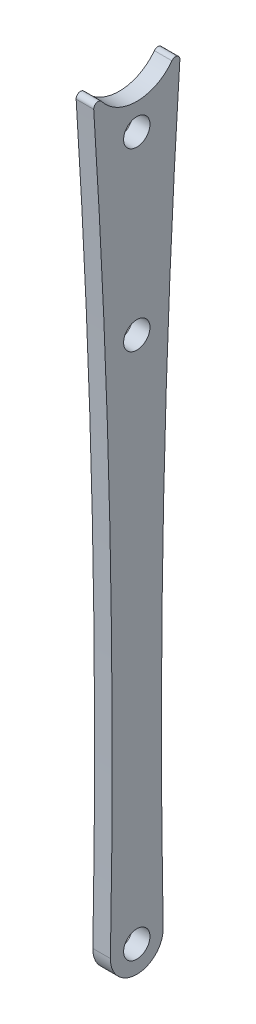
ISO-10303-21;
HEADER;
FILE_DESCRIPTION(('STEP AP214'),'2;1');
FILE_NAME('part.step','',(''),(''),'','','');
FILE_SCHEMA(('AUTOMOTIVE_DESIGN { 1 0 10303 214 1 1 1 1 }'));
ENDSEC;
DATA;
#1=APPLICATION_CONTEXT('core data for automotive mechanical design processes');
#2=APPLICATION_PROTOCOL_DEFINITION('international standard','automotive_design',2000,#1);
#3=PRODUCT_CONTEXT('',#1,'mechanical');
#4=PRODUCT('Part','Part','',(#3));
#5=PRODUCT_RELATED_PRODUCT_CATEGORY('part','',(#4));
#6=PRODUCT_DEFINITION_FORMATION('','',#4);
#7=PRODUCT_DEFINITION_CONTEXT('part definition',#1,'design');
#8=PRODUCT_DEFINITION('design','',#6,#7);
#9=PRODUCT_DEFINITION_SHAPE('','',#8);
#10=(LENGTH_UNIT() NAMED_UNIT(*) SI_UNIT(.MILLI.,.METRE.));
#11=(NAMED_UNIT(*) PLANE_ANGLE_UNIT() SI_UNIT($,.RADIAN.));
#12=(NAMED_UNIT(*) SI_UNIT($,.STERADIAN.) SOLID_ANGLE_UNIT());
#13=UNCERTAINTY_MEASURE_WITH_UNIT(LENGTH_MEASURE(1.E-05),#10,'distance_accuracy_value','');
#14=(GEOMETRIC_REPRESENTATION_CONTEXT(3) GLOBAL_UNCERTAINTY_ASSIGNED_CONTEXT((#13)) GLOBAL_UNIT_ASSIGNED_CONTEXT((#10,
#11,#12)) REPRESENTATION_CONTEXT('',''));
#15=CARTESIAN_POINT('',(0.,0.,0.));
#16=DIRECTION('',(0.,0.,1.));
#17=DIRECTION('',(1.,0.,0.));
#18=AXIS2_PLACEMENT_3D('',#15,#16,#17);
#19=CARTESIAN_POINT('',(2.,52.3191384121453,-503.600903748008));
#20=DIRECTION('',(-1.,0.,0.));
#21=DIRECTION('',(0.,0.,1.));
#22=AXIS2_PLACEMENT_3D('',#19,#20,#21);
#23=PLANE('',#22);
#24=CARTESIAN_POINT('',(2.,19.9382768242907,-1002.80180749602));
#25=DIRECTION('',(-1.,0.,0.));
#26=DIRECTION('',(0.,0.,1.));
#27=AXIS2_PLACEMENT_3D('',#24,#25,#26);
#28=CIRCLE('',#27,1000.);
#29=CARTESIAN_POINT('',(2.,0.0596359227047606,-2.99940720088548));
#30=VERTEX_POINT('',#29);
#31=CARTESIAN_POINT('',(2.,84.6676353207518,-4.8989514280341));
#32=VERTEX_POINT('',#31);
#33=EDGE_CURVE('E130',#30,#32,#28,.T.);
#34=ORIENTED_EDGE('',*,*,#33,.T.);
#35=CARTESIAN_POINT('',(2.,84.7,-4.4));
#36=DIRECTION('',(1.,0.,0.));
#37=DIRECTION('',(0.,0.,-1.));
#38=AXIS2_PLACEMENT_3D('',#35,#36,#37);
#39=CIRCLE('',#38,0.500000000000106);
#40=CARTESIAN_POINT('',(2.,85.,-4.));
#41=VERTEX_POINT('',#40);
#42=EDGE_CURVE('E88',#32,#41,#39,.T.);
#43=ORIENTED_EDGE('',*,*,#42,.T.);
#44=CARTESIAN_POINT('',(2.,88.,0.));
#45=DIRECTION('',(-1.,0.,0.));
#46=DIRECTION('',(0.,0.,1.));
#47=AXIS2_PLACEMENT_3D('',#44,#45,#46);
#48=CIRCLE('',#47,5.);
#49=CARTESIAN_POINT('',(2.,85.0000000000001,3.99999999999991));
#50=VERTEX_POINT('',#49);
#51=EDGE_CURVE('E101',#41,#50,#48,.T.);
#52=ORIENTED_EDGE('',*,*,#51,.T.);
#53=CARTESIAN_POINT('',(2.,84.7,4.4));
#54=DIRECTION('',(1.,0.,0.));
#55=DIRECTION('',(0.,0.,1.));
#56=AXIS2_PLACEMENT_3D('',#53,#54,#55);
#57=CIRCLE('',#56,0.500000000000106);
#58=CARTESIAN_POINT('',(2.,84.6676353207514,4.8989514280342));
#59=VERTEX_POINT('',#58);
#60=EDGE_CURVE('E95',#50,#59,#57,.T.);
#61=ORIENTED_EDGE('',*,*,#60,.T.);
#62=CARTESIAN_POINT('',(2.,19.9382768242907,1002.80180749602));
#63=DIRECTION('',(-1.,0.,0.));
#64=DIRECTION('',(0.,0.,-1.));
#65=AXIS2_PLACEMENT_3D('',#62,#63,#64);
#66=CIRCLE('',#65,1000.);
#67=CARTESIAN_POINT('',(2.,0.0596359227047596,2.99940720088548));
#68=VERTEX_POINT('',#67);
#69=EDGE_CURVE('E99',#59,#68,#66,.T.);
#70=ORIENTED_EDGE('',*,*,#69,.T.);
#71=CARTESIAN_POINT('',(2.,0.,0.));
#72=DIRECTION('',(1.,0.,0.));
#73=DIRECTION('',(0.,0.,-1.));
#74=AXIS2_PLACEMENT_3D('',#71,#72,#73);
#75=CIRCLE('',#74,3.00000000000008);
#76=EDGE_CURVE('E51',#68,#30,#75,.T.);
#77=ORIENTED_EDGE('',*,*,#76,.T.);
#78=EDGE_LOOP('',(#34,#43,#52,#61,#70,#77));
#79=FACE_BOUND('',#78,.T.);
#80=CARTESIAN_POINT('',(2.,0.,0.));
#81=DIRECTION('',(1.,0.,0.));
#82=DIRECTION('',(0.,0.,-1.));
#83=AXIS2_PLACEMENT_3D('',#80,#81,#82);
#84=CIRCLE('',#83,1.5);
#85=CARTESIAN_POINT('',(2.,0.,-1.5));
#86=VERTEX_POINT('',#85);
#87=EDGE_CURVE('E123',#86,#86,#84,.T.);
#88=ORIENTED_EDGE('',*,*,#87,.F.);
#89=EDGE_LOOP('',(#88));
#90=FACE_BOUND('',#89,.T.);
#91=CARTESIAN_POINT('',(2.,60.,0.));
#92=DIRECTION('',(1.,0.,0.));
#93=DIRECTION('',(0.,0.,-1.));
#94=AXIS2_PLACEMENT_3D('',#91,#92,#93);
#95=CIRCLE('',#94,1.5);
#96=CARTESIAN_POINT('',(2.,60.,-1.5));
#97=VERTEX_POINT('',#96);
#98=EDGE_CURVE('E184',#97,#97,#95,.T.);
#99=ORIENTED_EDGE('',*,*,#98,.F.);
#100=EDGE_LOOP('',(#99));
#101=FACE_BOUND('',#100,.T.);
#102=CARTESIAN_POINT('',(2.,80.,0.));
#103=DIRECTION('',(1.,0.,0.));
#104=DIRECTION('',(0.,0.,-1.));
#105=AXIS2_PLACEMENT_3D('',#102,#103,#104);
#106=CIRCLE('',#105,1.5);
#107=CARTESIAN_POINT('',(2.,80.,-1.5));
#108=VERTEX_POINT('',#107);
#109=EDGE_CURVE('E175',#108,#108,#106,.T.);
#110=ORIENTED_EDGE('',*,*,#109,.F.);
#111=EDGE_LOOP('',(#110));
#112=FACE_BOUND('',#111,.T.);
#113=ADVANCED_FACE('F34',(#79,#90,#101,#112),#23,.F.);
#114=CARTESIAN_POINT('',(0.,52.3191384121453,-503.600903748008));
#115=DIRECTION('',(-1.,0.,0.));
#116=DIRECTION('',(0.,0.,1.));
#117=AXIS2_PLACEMENT_3D('',#114,#115,#116);
#118=PLANE('',#117);
#119=CARTESIAN_POINT('',(0.,60.,0.));
#120=DIRECTION('',(1.,0.,0.));
#121=DIRECTION('',(0.,0.,-1.));
#122=AXIS2_PLACEMENT_3D('',#119,#120,#121);
#123=CIRCLE('',#122,1.5);
#124=CARTESIAN_POINT('',(0.,60.,-1.5));
#125=VERTEX_POINT('',#124);
#126=EDGE_CURVE('E181',#125,#125,#123,.T.);
#127=ORIENTED_EDGE('',*,*,#126,.T.);
#128=EDGE_LOOP('',(#127));
#129=FACE_BOUND('',#128,.T.);
#130=CARTESIAN_POINT('',(0.,19.9382768242907,-1002.80180749602));
#131=DIRECTION('',(-1.,0.,0.));
#132=DIRECTION('',(0.,0.,1.));
#133=AXIS2_PLACEMENT_3D('',#130,#131,#132);
#134=CIRCLE('',#133,1000.);
#135=CARTESIAN_POINT('',(0.,0.0596359227047606,-2.99940720088548));
#136=VERTEX_POINT('',#135);
#137=CARTESIAN_POINT('',(0.,84.6676353207518,-4.8989514280341));
#138=VERTEX_POINT('',#137);
#139=EDGE_CURVE('E119',#136,#138,#134,.T.);
#140=ORIENTED_EDGE('',*,*,#139,.F.);
#141=CARTESIAN_POINT('',(0.,0.,0.));
#142=DIRECTION('',(1.,0.,0.));
#143=DIRECTION('',(0.,0.,-1.));
#144=AXIS2_PLACEMENT_3D('',#141,#142,#143);
#145=CIRCLE('',#144,3.00000000000008);
#146=CARTESIAN_POINT('',(0.,0.0596359227047596,2.99940720088548));
#147=VERTEX_POINT('',#146);
#148=EDGE_CURVE('E80',#147,#136,#145,.T.);
#149=ORIENTED_EDGE('',*,*,#148,.F.);
#150=CARTESIAN_POINT('',(0.,19.9382768242907,1002.80180749602));
#151=DIRECTION('',(-1.,0.,0.));
#152=DIRECTION('',(0.,0.,-1.));
#153=AXIS2_PLACEMENT_3D('',#150,#151,#152);
#154=CIRCLE('',#153,1000.);
#155=CARTESIAN_POINT('',(0.,84.6676353207514,4.8989514280342));
#156=VERTEX_POINT('',#155);
#157=EDGE_CURVE('E74',#156,#147,#154,.T.);
#158=ORIENTED_EDGE('',*,*,#157,.F.);
#159=CARTESIAN_POINT('',(0.,84.7,4.4));
#160=DIRECTION('',(1.,0.,0.));
#161=DIRECTION('',(0.,0.,1.));
#162=AXIS2_PLACEMENT_3D('',#159,#160,#161);
#163=CIRCLE('',#162,0.500000000000106);
#164=CARTESIAN_POINT('',(0.,85.0000000000001,3.99999999999991));
#165=VERTEX_POINT('',#164);
#166=EDGE_CURVE('E109',#165,#156,#163,.T.);
#167=ORIENTED_EDGE('',*,*,#166,.F.);
#168=CARTESIAN_POINT('',(0.,88.,0.));
#169=DIRECTION('',(-1.,0.,0.));
#170=DIRECTION('',(0.,0.,1.));
#171=AXIS2_PLACEMENT_3D('',#168,#169,#170);
#172=CIRCLE('',#171,5.);
#173=CARTESIAN_POINT('',(0.,85.,-4.));
#174=VERTEX_POINT('',#173);
#175=EDGE_CURVE('E125',#174,#165,#172,.T.);
#176=ORIENTED_EDGE('',*,*,#175,.F.);
#177=CARTESIAN_POINT('',(0.,84.7,-4.4));
#178=DIRECTION('',(1.,0.,0.));
#179=DIRECTION('',(0.,0.,-1.));
#180=AXIS2_PLACEMENT_3D('',#177,#178,#179);
#181=CIRCLE('',#180,0.500000000000106);
#182=EDGE_CURVE('E122',#138,#174,#181,.T.);
#183=ORIENTED_EDGE('',*,*,#182,.F.);
#184=EDGE_LOOP('',(#140,#149,#158,#167,#176,#183));
#185=FACE_BOUND('',#184,.T.);
#186=CARTESIAN_POINT('',(0.,0.,0.));
#187=DIRECTION('',(1.,0.,0.));
#188=DIRECTION('',(0.,0.,-1.));
#189=AXIS2_PLACEMENT_3D('',#186,#187,#188);
#190=CIRCLE('',#189,1.5);
#191=CARTESIAN_POINT('',(0.,0.,-1.5));
#192=VERTEX_POINT('',#191);
#193=EDGE_CURVE('E187',#192,#192,#190,.T.);
#194=ORIENTED_EDGE('',*,*,#193,.T.);
#195=EDGE_LOOP('',(#194));
#196=FACE_BOUND('',#195,.T.);
#197=CARTESIAN_POINT('',(0.,80.,0.));
#198=DIRECTION('',(1.,0.,0.));
#199=DIRECTION('',(0.,0.,-1.));
#200=AXIS2_PLACEMENT_3D('',#197,#198,#199);
#201=CIRCLE('',#200,1.5);
#202=CARTESIAN_POINT('',(0.,80.,-1.5));
#203=VERTEX_POINT('',#202);
#204=EDGE_CURVE('E178',#203,#203,#201,.T.);
#205=ORIENTED_EDGE('',*,*,#204,.T.);
#206=EDGE_LOOP('',(#205));
#207=FACE_BOUND('',#206,.T.);
#208=ADVANCED_FACE('F139',(#129,#185,#196,#207),#118,.T.);
#209=CARTESIAN_POINT('',(2.,19.9382768242907,-1002.80180749602));
#210=DIRECTION('',(-1.,0.,0.));
#211=DIRECTION('',(0.,0.,1.));
#212=AXIS2_PLACEMENT_3D('',#209,#210,#211);
#213=CYLINDRICAL_SURFACE('',#212,1000.);
#214=ORIENTED_EDGE('',*,*,#139,.T.);
#215=DIRECTION('',(-1.,0.,0.));
#216=VECTOR('',#215,1.);
#217=CARTESIAN_POINT('',(2.,84.6676353207518,-4.8989514280341));
#218=LINE('',#217,#216);
#219=EDGE_CURVE('E11',#32,#138,#218,.T.);
#220=ORIENTED_EDGE('',*,*,#219,.F.);
#221=ORIENTED_EDGE('',*,*,#33,.F.);
#222=DIRECTION('',(-1.,0.,0.));
#223=VECTOR('',#222,1.);
#224=CARTESIAN_POINT('',(2.,0.0596359227047606,-2.99940720088548));
#225=LINE('',#224,#223);
#226=EDGE_CURVE('E115',#30,#136,#225,.T.);
#227=ORIENTED_EDGE('',*,*,#226,.T.);
#228=EDGE_LOOP('',(#214,#220,#221,#227));
#229=FACE_BOUND('',#228,.T.);
#230=ADVANCED_FACE('F36',(#229),#213,.F.);
#231=CARTESIAN_POINT('',(2.,84.7,-4.4));
#232=DIRECTION('',(-1.,0.,0.));
#233=DIRECTION('',(0.,0.,1.));
#234=AXIS2_PLACEMENT_3D('',#231,#232,#233);
#235=CYLINDRICAL_SURFACE('',#234,0.500000000000106);
#236=ORIENTED_EDGE('',*,*,#182,.T.);
#237=DIRECTION('',(-1.,0.,0.));
#238=VECTOR('',#237,1.);
#239=CARTESIAN_POINT('',(2.,85.,-4.));
#240=LINE('',#239,#238);
#241=EDGE_CURVE('E43',#41,#174,#240,.T.);
#242=ORIENTED_EDGE('',*,*,#241,.F.);
#243=ORIENTED_EDGE('',*,*,#42,.F.);
#244=ORIENTED_EDGE('',*,*,#219,.T.);
#245=EDGE_LOOP('',(#236,#242,#243,#244));
#246=FACE_BOUND('',#245,.T.);
#247=ADVANCED_FACE('F238',(#246),#235,.T.);
#248=CARTESIAN_POINT('',(2.,88.,0.));
#249=DIRECTION('',(-1.,0.,0.));
#250=DIRECTION('',(0.,0.,1.));
#251=AXIS2_PLACEMENT_3D('',#248,#249,#250);
#252=CYLINDRICAL_SURFACE('',#251,5.);
#253=ORIENTED_EDGE('',*,*,#175,.T.);
#254=DIRECTION('',(-1.,0.,0.));
#255=VECTOR('',#254,1.);
#256=CARTESIAN_POINT('',(2.,85.0000000000001,3.99999999999991));
#257=LINE('',#256,#255);
#258=EDGE_CURVE('E110',#50,#165,#257,.T.);
#259=ORIENTED_EDGE('',*,*,#258,.F.);
#260=ORIENTED_EDGE('',*,*,#51,.F.);
#261=ORIENTED_EDGE('',*,*,#241,.T.);
#262=EDGE_LOOP('',(#253,#259,#260,#261));
#263=FACE_BOUND('',#262,.T.);
#264=ADVANCED_FACE('F136',(#263),#252,.F.);
#265=CARTESIAN_POINT('',(2.,84.7,4.4));
#266=DIRECTION('',(-1.,0.,0.));
#267=DIRECTION('',(0.,0.,1.));
#268=AXIS2_PLACEMENT_3D('',#265,#266,#267);
#269=CYLINDRICAL_SURFACE('',#268,0.500000000000106);
#270=ORIENTED_EDGE('',*,*,#166,.T.);
#271=DIRECTION('',(-1.,0.,0.));
#272=VECTOR('',#271,1.);
#273=CARTESIAN_POINT('',(2.,84.6676353207514,4.8989514280342));
#274=LINE('',#273,#272);
#275=EDGE_CURVE('E106',#59,#156,#274,.T.);
#276=ORIENTED_EDGE('',*,*,#275,.F.);
#277=ORIENTED_EDGE('',*,*,#60,.F.);
#278=ORIENTED_EDGE('',*,*,#258,.T.);
#279=EDGE_LOOP('',(#270,#276,#277,#278));
#280=FACE_BOUND('',#279,.T.);
#281=ADVANCED_FACE('F107',(#280),#269,.T.);
#282=CARTESIAN_POINT('',(2.,19.9382768242907,1002.80180749602));
#283=DIRECTION('',(-1.,0.,0.));
#284=DIRECTION('',(0.,0.,1.));
#285=AXIS2_PLACEMENT_3D('',#282,#283,#284);
#286=CYLINDRICAL_SURFACE('',#285,1000.);
#287=ORIENTED_EDGE('',*,*,#157,.T.);
#288=DIRECTION('',(-1.,0.,0.));
#289=VECTOR('',#288,1.);
#290=CARTESIAN_POINT('',(2.,0.0596359227047596,2.99940720088548));
#291=LINE('',#290,#289);
#292=EDGE_CURVE('E111',#68,#147,#291,.T.);
#293=ORIENTED_EDGE('',*,*,#292,.F.);
#294=ORIENTED_EDGE('',*,*,#69,.F.);
#295=ORIENTED_EDGE('',*,*,#275,.T.);
#296=EDGE_LOOP('',(#287,#293,#294,#295));
#297=FACE_BOUND('',#296,.T.);
#298=ADVANCED_FACE('F113',(#297),#286,.F.);
#299=CARTESIAN_POINT('',(2.,0.,0.));
#300=DIRECTION('',(-1.,0.,0.));
#301=DIRECTION('',(0.,0.,1.));
#302=AXIS2_PLACEMENT_3D('',#299,#300,#301);
#303=CYLINDRICAL_SURFACE('',#302,3.00000000000008);
#304=ORIENTED_EDGE('',*,*,#148,.T.);
#305=ORIENTED_EDGE('',*,*,#226,.F.);
#306=ORIENTED_EDGE('',*,*,#76,.F.);
#307=ORIENTED_EDGE('',*,*,#292,.T.);
#308=EDGE_LOOP('',(#304,#305,#306,#307));
#309=FACE_BOUND('',#308,.T.);
#310=ADVANCED_FACE('F144',(#309),#303,.T.);
#311=CARTESIAN_POINT('',(2.,0.,0.));
#312=DIRECTION('',(-1.,0.,0.));
#313=DIRECTION('',(0.,0.,1.));
#314=AXIS2_PLACEMENT_3D('',#311,#312,#313);
#315=CYLINDRICAL_SURFACE('',#314,1.5);
#316=ORIENTED_EDGE('',*,*,#87,.T.);
#317=EDGE_LOOP('',(#316));
#318=FACE_BOUND('',#317,.T.);
#319=ORIENTED_EDGE('',*,*,#193,.F.);
#320=EDGE_LOOP('',(#319));
#321=FACE_BOUND('',#320,.T.);
#322=ADVANCED_FACE('F146',(#318,#321),#315,.F.);
#323=CARTESIAN_POINT('',(2.,60.,0.));
#324=DIRECTION('',(-1.,0.,0.));
#325=DIRECTION('',(0.,0.,1.));
#326=AXIS2_PLACEMENT_3D('',#323,#324,#325);
#327=CYLINDRICAL_SURFACE('',#326,1.5);
#328=ORIENTED_EDGE('',*,*,#98,.T.);
#329=EDGE_LOOP('',(#328));
#330=FACE_BOUND('',#329,.T.);
#331=ORIENTED_EDGE('',*,*,#126,.F.);
#332=EDGE_LOOP('',(#331));
#333=FACE_BOUND('',#332,.T.);
#334=ADVANCED_FACE('F152',(#330,#333),#327,.F.);
#335=CARTESIAN_POINT('',(2.,80.,0.));
#336=DIRECTION('',(-1.,0.,0.));
#337=DIRECTION('',(0.,0.,1.));
#338=AXIS2_PLACEMENT_3D('',#335,#336,#337);
#339=CYLINDRICAL_SURFACE('',#338,1.5);
#340=ORIENTED_EDGE('',*,*,#109,.T.);
#341=EDGE_LOOP('',(#340));
#342=FACE_BOUND('',#341,.T.);
#343=ORIENTED_EDGE('',*,*,#204,.F.);
#344=EDGE_LOOP('',(#343));
#345=FACE_BOUND('',#344,.T.);
#346=ADVANCED_FACE('F166',(#342,#345),#339,.F.);
#347=CLOSED_SHELL('',(#113,#208,#230,#247,#264,#281,#298,#310,#322,#334,#346));
#348=MANIFOLD_SOLID_BREP('B2',#347);
#349=ADVANCED_BREP_SHAPE_REPRESENTATION('',(#18,#348),#14);
#350=SHAPE_DEFINITION_REPRESENTATION(#9,#349);
ENDSEC;
END-ISO-10303-21;
